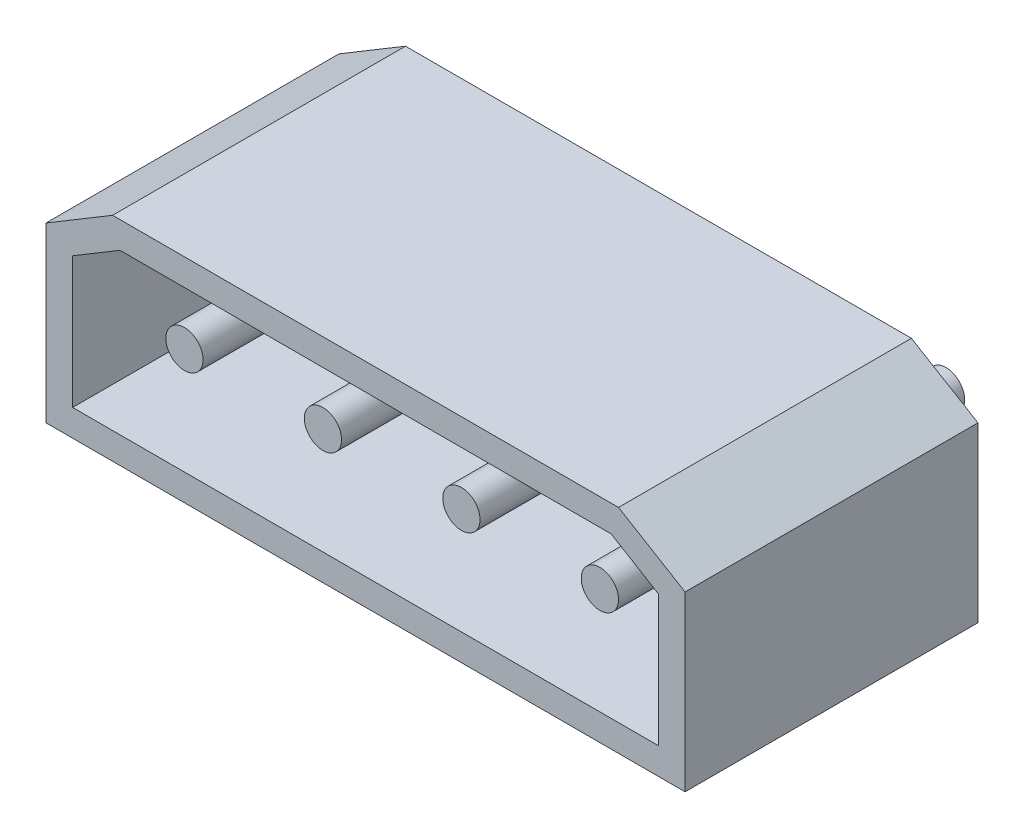
ISO-10303-21;
HEADER;
FILE_DESCRIPTION(('STEP AP214'),'2;1');
FILE_NAME('part.step','',(''),(''),'','','');
FILE_SCHEMA(('AUTOMOTIVE_DESIGN { 1 0 10303 214 1 1 1 1 }'));
ENDSEC;
DATA;
#1=APPLICATION_CONTEXT('core data for automotive mechanical design processes');
#2=APPLICATION_PROTOCOL_DEFINITION('international standard','automotive_design',2000,#1);
#3=PRODUCT_CONTEXT('',#1,'mechanical');
#4=PRODUCT('Part','Part','',(#3));
#5=PRODUCT_RELATED_PRODUCT_CATEGORY('part','',(#4));
#6=PRODUCT_DEFINITION_FORMATION('','',#4);
#7=PRODUCT_DEFINITION_CONTEXT('part definition',#1,'design');
#8=PRODUCT_DEFINITION('design','',#6,#7);
#9=PRODUCT_DEFINITION_SHAPE('','',#8);
#10=(LENGTH_UNIT() NAMED_UNIT(*) SI_UNIT(.MILLI.,.METRE.));
#11=(NAMED_UNIT(*) PLANE_ANGLE_UNIT() SI_UNIT($,.RADIAN.));
#12=(NAMED_UNIT(*) SI_UNIT($,.STERADIAN.) SOLID_ANGLE_UNIT());
#13=UNCERTAINTY_MEASURE_WITH_UNIT(LENGTH_MEASURE(1.E-05),#10,'distance_accuracy_value','');
#14=(GEOMETRIC_REPRESENTATION_CONTEXT(3) GLOBAL_UNCERTAINTY_ASSIGNED_CONTEXT((#13)) GLOBAL_UNIT_ASSIGNED_CONTEXT((#10,
#11,#12)) REPRESENTATION_CONTEXT('',''));
#15=CARTESIAN_POINT('',(0.,0.,0.));
#16=DIRECTION('',(0.,0.,1.));
#17=DIRECTION('',(1.,0.,0.));
#18=AXIS2_PLACEMENT_3D('',#15,#16,#17);
#19=CARTESIAN_POINT('',(2907.57830573472,1607.21256662611,10.));
#20=DIRECTION('',(0.,0.,-1.));
#21=DIRECTION('',(-1.,0.,0.));
#22=AXIS2_PLACEMENT_3D('',#19,#20,#21);
#23=CYLINDRICAL_SURFACE('',#22,0.700000000000115);
#24=CARTESIAN_POINT('',(2907.57830573472,1607.21256662611,2.));
#25=DIRECTION('',(0.,0.,1.));
#26=DIRECTION('',(1.,0.,0.));
#27=AXIS2_PLACEMENT_3D('',#24,#25,#26);
#28=CIRCLE('',#27,0.700000000000115);
#29=CARTESIAN_POINT('',(2908.27830573472,1607.21256662611,2.));
#30=VERTEX_POINT('',#29);
#31=EDGE_CURVE('E42',#30,#30,#28,.F.);
#32=ORIENTED_EDGE('',*,*,#31,.F.);
#33=EDGE_LOOP('',(#32));
#34=FACE_BOUND('',#33,.T.);
#35=CARTESIAN_POINT('',(2907.57830573472,1607.21256662611,10.));
#36=DIRECTION('',(0.,0.,1.));
#37=DIRECTION('',(1.,0.,0.));
#38=AXIS2_PLACEMENT_3D('',#35,#36,#37);
#39=CIRCLE('',#38,0.700000000000115);
#40=CARTESIAN_POINT('',(2908.27830573472,1607.21256662611,10.));
#41=VERTEX_POINT('',#40);
#42=EDGE_CURVE('E11',#41,#41,#39,.T.);
#43=ORIENTED_EDGE('',*,*,#42,.F.);
#44=EDGE_LOOP('',(#43));
#45=FACE_BOUND('',#44,.T.);
#46=ADVANCED_FACE('F35',(#34,#45),#23,.T.);
#47=CARTESIAN_POINT('',(2907.57830573472,1607.21256662611,10.));
#48=DIRECTION('',(0.,0.,1.));
#49=DIRECTION('',(1.,0.,0.));
#50=AXIS2_PLACEMENT_3D('',#47,#48,#49);
#51=PLANE('',#50);
#52=ORIENTED_EDGE('',*,*,#42,.T.);
#53=EDGE_LOOP('',(#52));
#54=FACE_BOUND('',#53,.T.);
#55=ADVANCED_FACE('F189',(#54),#51,.T.);
#56=CARTESIAN_POINT('',(2902.37830573472,1607.21256662611,10.));
#57=DIRECTION('',(0.,0.,-1.));
#58=DIRECTION('',(-1.,0.,0.));
#59=AXIS2_PLACEMENT_3D('',#56,#57,#58);
#60=CYLINDRICAL_SURFACE('',#59,0.700000000000115);
#61=CARTESIAN_POINT('',(2902.37830573472,1607.21256662611,2.));
#62=DIRECTION('',(0.,0.,1.));
#63=DIRECTION('',(1.,0.,0.));
#64=AXIS2_PLACEMENT_3D('',#61,#62,#63);
#65=CIRCLE('',#64,0.700000000000115);
#66=CARTESIAN_POINT('',(2903.07830573472,1607.21256662611,2.));
#67=VERTEX_POINT('',#66);
#68=EDGE_CURVE('E177',#67,#67,#65,.F.);
#69=ORIENTED_EDGE('',*,*,#68,.F.);
#70=EDGE_LOOP('',(#69));
#71=FACE_BOUND('',#70,.T.);
#72=CARTESIAN_POINT('',(2902.37830573472,1607.21256662611,10.));
#73=DIRECTION('',(0.,0.,1.));
#74=DIRECTION('',(1.,0.,0.));
#75=AXIS2_PLACEMENT_3D('',#72,#73,#74);
#76=CIRCLE('',#75,0.700000000000115);
#77=CARTESIAN_POINT('',(2903.07830573472,1607.21256662611,10.));
#78=VERTEX_POINT('',#77);
#79=EDGE_CURVE('E180',#78,#78,#76,.T.);
#80=ORIENTED_EDGE('',*,*,#79,.F.);
#81=EDGE_LOOP('',(#80));
#82=FACE_BOUND('',#81,.T.);
#83=ADVANCED_FACE('F193',(#71,#82),#60,.T.);
#84=CARTESIAN_POINT('',(2902.37830573472,1607.21256662611,10.));
#85=DIRECTION('',(0.,0.,1.));
#86=DIRECTION('',(1.,0.,0.));
#87=AXIS2_PLACEMENT_3D('',#84,#85,#86);
#88=PLANE('',#87);
#89=ORIENTED_EDGE('',*,*,#79,.T.);
#90=EDGE_LOOP('',(#89));
#91=FACE_BOUND('',#90,.T.);
#92=ADVANCED_FACE('F197',(#91),#88,.T.);
#93=CARTESIAN_POINT('',(2907.57830573472,1607.21256662611,-3.));
#94=DIRECTION('',(0.,0.,-1.));
#95=DIRECTION('',(-1.,0.,0.));
#96=AXIS2_PLACEMENT_3D('',#93,#94,#95);
#97=PLANE('',#96);
#98=CARTESIAN_POINT('',(2907.57830573472,1607.21256662611,-3.));
#99=DIRECTION('',(0.,0.,-1.));
#100=DIRECTION('',(-1.,0.,0.));
#101=AXIS2_PLACEMENT_3D('',#98,#99,#100);
#102=CIRCLE('',#101,0.700000000000115);
#103=CARTESIAN_POINT('',(2906.87830573472,1607.21256662611,-3.));
#104=VERTEX_POINT('',#103);
#105=EDGE_CURVE('E174',#104,#104,#102,.T.);
#106=ORIENTED_EDGE('',*,*,#105,.T.);
#107=EDGE_LOOP('',(#106));
#108=FACE_BOUND('',#107,.T.);
#109=ADVANCED_FACE('F203',(#108),#97,.T.);
#110=CARTESIAN_POINT('',(2907.57830573472,1607.21256662611,10.));
#111=DIRECTION('',(0.,0.,-1.));
#112=DIRECTION('',(-1.,0.,0.));
#113=AXIS2_PLACEMENT_3D('',#110,#111,#112);
#114=CYLINDRICAL_SURFACE('',#113,0.700000000000115);
#115=CARTESIAN_POINT('',(2907.57830573472,1607.21256662611,0.));
#116=DIRECTION('',(0.,0.,1.));
#117=DIRECTION('',(1.,0.,0.));
#118=AXIS2_PLACEMENT_3D('',#115,#116,#117);
#119=CIRCLE('',#118,0.700000000000115);
#120=CARTESIAN_POINT('',(2908.27830573472,1607.21256662611,0.));
#121=VERTEX_POINT('',#120);
#122=EDGE_CURVE('E171',#121,#121,#119,.F.);
#123=ORIENTED_EDGE('',*,*,#122,.T.);
#124=EDGE_LOOP('',(#123));
#125=FACE_BOUND('',#124,.T.);
#126=ORIENTED_EDGE('',*,*,#105,.F.);
#127=EDGE_LOOP('',(#126));
#128=FACE_BOUND('',#127,.T.);
#129=ADVANCED_FACE('F207',(#125,#128),#114,.T.);
#130=CARTESIAN_POINT('',(2902.37830573472,1607.21256662611,-3.));
#131=DIRECTION('',(0.,0.,-1.));
#132=DIRECTION('',(-1.,0.,0.));
#133=AXIS2_PLACEMENT_3D('',#130,#131,#132);
#134=PLANE('',#133);
#135=CARTESIAN_POINT('',(2902.37830573472,1607.21256662611,-3.));
#136=DIRECTION('',(0.,0.,-1.));
#137=DIRECTION('',(-1.,0.,0.));
#138=AXIS2_PLACEMENT_3D('',#135,#136,#137);
#139=CIRCLE('',#138,0.700000000000115);
#140=CARTESIAN_POINT('',(2901.67830573472,1607.21256662611,-3.));
#141=VERTEX_POINT('',#140);
#142=EDGE_CURVE('E168',#141,#141,#139,.T.);
#143=ORIENTED_EDGE('',*,*,#142,.T.);
#144=EDGE_LOOP('',(#143));
#145=FACE_BOUND('',#144,.T.);
#146=ADVANCED_FACE('F211',(#145),#134,.T.);
#147=CARTESIAN_POINT('',(2902.37830573472,1607.21256662611,10.));
#148=DIRECTION('',(0.,0.,-1.));
#149=DIRECTION('',(-1.,0.,0.));
#150=AXIS2_PLACEMENT_3D('',#147,#148,#149);
#151=CYLINDRICAL_SURFACE('',#150,0.700000000000115);
#152=CARTESIAN_POINT('',(2902.37830573472,1607.21256662611,0.));
#153=DIRECTION('',(0.,0.,1.));
#154=DIRECTION('',(1.,0.,0.));
#155=AXIS2_PLACEMENT_3D('',#152,#153,#154);
#156=CIRCLE('',#155,0.700000000000115);
#157=CARTESIAN_POINT('',(2903.07830573472,1607.21256662611,0.));
#158=VERTEX_POINT('',#157);
#159=EDGE_CURVE('E165',#158,#158,#156,.F.);
#160=ORIENTED_EDGE('',*,*,#159,.T.);
#161=EDGE_LOOP('',(#160));
#162=FACE_BOUND('',#161,.T.);
#163=ORIENTED_EDGE('',*,*,#142,.F.);
#164=EDGE_LOOP('',(#163));
#165=FACE_BOUND('',#164,.T.);
#166=ADVANCED_FACE('F215',(#162,#165),#151,.T.);
#167=CARTESIAN_POINT('',(2891.97830573472,1607.21256662611,10.));
#168=DIRECTION('',(0.,0.,-1.));
#169=DIRECTION('',(-1.,0.,0.));
#170=AXIS2_PLACEMENT_3D('',#167,#168,#169);
#171=CYLINDRICAL_SURFACE('',#170,0.700000000000115);
#172=CARTESIAN_POINT('',(2891.97830573472,1607.21256662611,0.));
#173=DIRECTION('',(0.,0.,1.));
#174=DIRECTION('',(1.,0.,0.));
#175=AXIS2_PLACEMENT_3D('',#172,#173,#174);
#176=CIRCLE('',#175,0.700000000000115);
#177=CARTESIAN_POINT('',(2892.67830573472,1607.21256662611,0.));
#178=VERTEX_POINT('',#177);
#179=EDGE_CURVE('E153',#178,#178,#176,.F.);
#180=ORIENTED_EDGE('',*,*,#179,.T.);
#181=EDGE_LOOP('',(#180));
#182=FACE_BOUND('',#181,.T.);
#183=CARTESIAN_POINT('',(2891.97830573472,1607.21256662611,-3.));
#184=DIRECTION('',(0.,0.,-1.));
#185=DIRECTION('',(-1.,0.,0.));
#186=AXIS2_PLACEMENT_3D('',#183,#184,#185);
#187=CIRCLE('',#186,0.700000000000115);
#188=CARTESIAN_POINT('',(2891.27830573472,1607.21256662611,-3.));
#189=VERTEX_POINT('',#188);
#190=EDGE_CURVE('E158',#189,#189,#187,.T.);
#191=ORIENTED_EDGE('',*,*,#190,.F.);
#192=EDGE_LOOP('',(#191));
#193=FACE_BOUND('',#192,.T.);
#194=ADVANCED_FACE('F219',(#182,#193),#171,.T.);
#195=CARTESIAN_POINT('',(2887.77830573472,1609.71256662611,11.));
#196=DIRECTION('',(0.514495755427549,-0.857492925712531,0.));
#197=DIRECTION('',(0.857492925712531,0.514495755427549,0.));
#198=AXIS2_PLACEMENT_3D('',#195,#196,#197);
#199=PLANE('',#198);
#200=DIRECTION('',(-0.857492925712531,-0.514495755427549,0.));
#201=VECTOR('',#200,1.);
#202=CARTESIAN_POINT('',(2887.77830573472,1609.71256662611,0.));
#203=LINE('',#202,#201);
#204=CARTESIAN_POINT('',(2890.27830573472,1611.21256662611,0.));
#205=VERTEX_POINT('',#204);
#206=CARTESIAN_POINT('',(2887.77830573472,1609.71256662611,0.));
#207=VERTEX_POINT('',#206);
#208=EDGE_CURVE('E132',#205,#207,#203,.T.);
#209=ORIENTED_EDGE('',*,*,#208,.T.);
#210=DIRECTION('',(0.,0.,-1.));
#211=VECTOR('',#210,1.);
#212=CARTESIAN_POINT('',(2887.77830573472,1609.71256662611,11.));
#213=LINE('',#212,#211);
#214=CARTESIAN_POINT('',(2887.77830573472,1609.71256662611,11.));
#215=VERTEX_POINT('',#214);
#216=EDGE_CURVE('E151',#215,#207,#213,.T.);
#217=ORIENTED_EDGE('',*,*,#216,.F.);
#218=DIRECTION('',(-0.857492925712531,-0.514495755427549,0.));
#219=VECTOR('',#218,1.);
#220=CARTESIAN_POINT('',(2887.77830573472,1609.71256662611,11.));
#221=LINE('',#220,#219);
#222=CARTESIAN_POINT('',(2890.27830573472,1611.21256662611,11.));
#223=VERTEX_POINT('',#222);
#224=EDGE_CURVE('E144',#223,#215,#221,.T.);
#225=ORIENTED_EDGE('',*,*,#224,.F.);
#226=DIRECTION('',(0.,0.,-1.));
#227=VECTOR('',#226,1.);
#228=CARTESIAN_POINT('',(2890.27830573472,1611.21256662611,11.));
#229=LINE('',#228,#227);
#230=EDGE_CURVE('E128',#223,#205,#229,.T.);
#231=ORIENTED_EDGE('',*,*,#230,.T.);
#232=EDGE_LOOP('',(#209,#217,#225,#231));
#233=FACE_BOUND('',#232,.T.);
#234=ADVANCED_FACE('F221',(#233),#199,.F.);
#235=CARTESIAN_POINT('',(2887.77830573472,1603.21256662611,11.));
#236=DIRECTION('',(1.,0.,0.));
#237=DIRECTION('',(0.,0.,-1.));
#238=AXIS2_PLACEMENT_3D('',#235,#236,#237);
#239=PLANE('',#238);
#240=DIRECTION('',(0.,-1.,0.));
#241=VECTOR('',#240,1.);
#242=CARTESIAN_POINT('',(2887.77830573472,1603.21256662611,0.));
#243=LINE('',#242,#241);
#244=CARTESIAN_POINT('',(2887.77830573472,1603.21256662611,0.));
#245=VERTEX_POINT('',#244);
#246=EDGE_CURVE('E135',#207,#245,#243,.T.);
#247=ORIENTED_EDGE('',*,*,#246,.T.);
#248=DIRECTION('',(0.,0.,-1.));
#249=VECTOR('',#248,1.);
#250=CARTESIAN_POINT('',(2887.77830573472,1603.21256662611,11.));
#251=LINE('',#250,#249);
#252=CARTESIAN_POINT('',(2887.77830573472,1603.21256662611,11.));
#253=VERTEX_POINT('',#252);
#254=EDGE_CURVE('E148',#253,#245,#251,.T.);
#255=ORIENTED_EDGE('',*,*,#254,.F.);
#256=DIRECTION('',(0.,-1.,0.));
#257=VECTOR('',#256,1.);
#258=CARTESIAN_POINT('',(2887.77830573472,1603.21256662611,11.));
#259=LINE('',#258,#257);
#260=EDGE_CURVE('E94',#215,#253,#259,.T.);
#261=ORIENTED_EDGE('',*,*,#260,.F.);
#262=ORIENTED_EDGE('',*,*,#216,.T.);
#263=EDGE_LOOP('',(#247,#255,#261,#262));
#264=FACE_BOUND('',#263,.T.);
#265=ADVANCED_FACE('F224',(#264),#239,.F.);
#266=CARTESIAN_POINT('',(2887.77830573472,1603.21256662611,11.));
#267=DIRECTION('',(0.,1.,0.));
#268=DIRECTION('',(0.,0.,1.));
#269=AXIS2_PLACEMENT_3D('',#266,#267,#268);
#270=PLANE('',#269);
#271=DIRECTION('',(1.,0.,0.));
#272=VECTOR('',#271,1.);
#273=CARTESIAN_POINT('',(2887.77830573472,1603.21256662611,0.));
#274=LINE('',#273,#272);
#275=CARTESIAN_POINT('',(2911.77830573472,1603.21256662611,0.));
#276=VERTEX_POINT('',#275);
#277=EDGE_CURVE('E138',#245,#276,#274,.T.);
#278=ORIENTED_EDGE('',*,*,#277,.T.);
#279=DIRECTION('',(0.,0.,-1.));
#280=VECTOR('',#279,1.);
#281=CARTESIAN_POINT('',(2911.77830573472,1603.21256662611,11.));
#282=LINE('',#281,#280);
#283=CARTESIAN_POINT('',(2911.77830573472,1603.21256662611,11.));
#284=VERTEX_POINT('',#283);
#285=EDGE_CURVE('E123',#284,#276,#282,.T.);
#286=ORIENTED_EDGE('',*,*,#285,.F.);
#287=DIRECTION('',(1.,0.,0.));
#288=VECTOR('',#287,1.);
#289=CARTESIAN_POINT('',(2887.77830573472,1603.21256662611,11.));
#290=LINE('',#289,#288);
#291=EDGE_CURVE('E111',#253,#284,#290,.T.);
#292=ORIENTED_EDGE('',*,*,#291,.F.);
#293=ORIENTED_EDGE('',*,*,#254,.T.);
#294=EDGE_LOOP('',(#278,#286,#292,#293));
#295=FACE_BOUND('',#294,.T.);
#296=ADVANCED_FACE('F228',(#295),#270,.F.);
#297=CARTESIAN_POINT('',(2911.77830573472,1603.21256662611,11.));
#298=DIRECTION('',(-1.,0.,0.));
#299=DIRECTION('',(0.,0.,1.));
#300=AXIS2_PLACEMENT_3D('',#297,#298,#299);
#301=PLANE('',#300);
#302=DIRECTION('',(0.,1.,0.));
#303=VECTOR('',#302,1.);
#304=CARTESIAN_POINT('',(2911.77830573472,1603.21256662611,0.));
#305=LINE('',#304,#303);
#306=CARTESIAN_POINT('',(2911.77830573472,1609.71256662611,0.));
#307=VERTEX_POINT('',#306);
#308=EDGE_CURVE('E120',#276,#307,#305,.T.);
#309=ORIENTED_EDGE('',*,*,#308,.T.);
#310=DIRECTION('',(0.,0.,-1.));
#311=VECTOR('',#310,1.);
#312=CARTESIAN_POINT('',(2911.77830573472,1609.71256662611,11.));
#313=LINE('',#312,#311);
#314=CARTESIAN_POINT('',(2911.77830573472,1609.71256662611,11.));
#315=VERTEX_POINT('',#314);
#316=EDGE_CURVE('E117',#315,#307,#313,.T.);
#317=ORIENTED_EDGE('',*,*,#316,.F.);
#318=DIRECTION('',(0.,1.,0.));
#319=VECTOR('',#318,1.);
#320=CARTESIAN_POINT('',(2911.77830573472,1603.21256662611,11.));
#321=LINE('',#320,#319);
#322=EDGE_CURVE('E104',#284,#315,#321,.T.);
#323=ORIENTED_EDGE('',*,*,#322,.F.);
#324=ORIENTED_EDGE('',*,*,#285,.T.);
#325=EDGE_LOOP('',(#309,#317,#323,#324));
#326=FACE_BOUND('',#325,.T.);
#327=ADVANCED_FACE('F118',(#326),#301,.F.);
#328=CARTESIAN_POINT('',(2911.77830573472,1609.71256662611,11.));
#329=DIRECTION('',(-0.514495755427549,-0.857492925712531,0.));
#330=DIRECTION('',(0.857492925712531,-0.514495755427549,0.));
#331=AXIS2_PLACEMENT_3D('',#328,#329,#330);
#332=PLANE('',#331);
#333=DIRECTION('',(-0.857492925712531,0.514495755427549,0.));
#334=VECTOR('',#333,1.);
#335=CARTESIAN_POINT('',(2911.77830573472,1609.71256662611,0.));
#336=LINE('',#335,#334);
#337=CARTESIAN_POINT('',(2909.27830573472,1611.21256662611,0.));
#338=VERTEX_POINT('',#337);
#339=EDGE_CURVE('E141',#307,#338,#336,.T.);
#340=ORIENTED_EDGE('',*,*,#339,.T.);
#341=DIRECTION('',(0.,0.,-1.));
#342=VECTOR('',#341,1.);
#343=CARTESIAN_POINT('',(2909.27830573472,1611.21256662611,11.));
#344=LINE('',#343,#342);
#345=CARTESIAN_POINT('',(2909.27830573472,1611.21256662611,11.));
#346=VERTEX_POINT('',#345);
#347=EDGE_CURVE('E124',#346,#338,#344,.T.);
#348=ORIENTED_EDGE('',*,*,#347,.F.);
#349=DIRECTION('',(-0.857492925712531,0.514495755427549,0.));
#350=VECTOR('',#349,1.);
#351=CARTESIAN_POINT('',(2911.77830573472,1609.71256662611,11.));
#352=LINE('',#351,#350);
#353=EDGE_CURVE('E108',#315,#346,#352,.T.);
#354=ORIENTED_EDGE('',*,*,#353,.F.);
#355=ORIENTED_EDGE('',*,*,#316,.T.);
#356=EDGE_LOOP('',(#340,#348,#354,#355));
#357=FACE_BOUND('',#356,.T.);
#358=ADVANCED_FACE('F126',(#357),#332,.F.);
#359=CARTESIAN_POINT('',(2890.27830573472,1611.21256662611,11.));
#360=DIRECTION('',(0.,-1.,0.));
#361=DIRECTION('',(0.,0.,-1.));
#362=AXIS2_PLACEMENT_3D('',#359,#360,#361);
#363=PLANE('',#362);
#364=DIRECTION('',(-1.,0.,0.));
#365=VECTOR('',#364,1.);
#366=CARTESIAN_POINT('',(2890.27830573472,1611.21256662611,0.));
#367=LINE('',#366,#365);
#368=EDGE_CURVE('E85',#338,#205,#367,.T.);
#369=ORIENTED_EDGE('',*,*,#368,.T.);
#370=ORIENTED_EDGE('',*,*,#230,.F.);
#371=DIRECTION('',(-1.,0.,0.));
#372=VECTOR('',#371,1.);
#373=CARTESIAN_POINT('',(2890.27830573472,1611.21256662611,11.));
#374=LINE('',#373,#372);
#375=EDGE_CURVE('E58',#346,#223,#374,.T.);
#376=ORIENTED_EDGE('',*,*,#375,.F.);
#377=ORIENTED_EDGE('',*,*,#347,.T.);
#378=EDGE_LOOP('',(#369,#370,#376,#377));
#379=FACE_BOUND('',#378,.T.);
#380=ADVANCED_FACE('F236',(#379),#363,.F.);
#381=CARTESIAN_POINT('',(0.,0.,11.));
#382=DIRECTION('',(0.,0.,1.));
#383=DIRECTION('',(1.,0.,0.));
#384=AXIS2_PLACEMENT_3D('',#381,#382,#383);
#385=PLANE('',#384);
#386=DIRECTION('',(-1.,0.,0.));
#387=VECTOR('',#386,1.);
#388=CARTESIAN_POINT('',(2909.00132176977,1610.21256662611,11.));
#389=LINE('',#388,#387);
#390=CARTESIAN_POINT('',(2909.00132176977,1610.21256662611,11.));
#391=VERTEX_POINT('',#390);
#392=CARTESIAN_POINT('',(2890.55528969967,1610.21256662611,11.));
#393=VERTEX_POINT('',#392);
#394=EDGE_CURVE('E49',#391,#393,#389,.T.);
#395=ORIENTED_EDGE('',*,*,#394,.F.);
#396=DIRECTION('',(-0.857492925712535,0.514495755427542,0.));
#397=VECTOR('',#396,1.);
#398=CARTESIAN_POINT('',(2910.77830573472,1609.14637624714,11.));
#399=LINE('',#398,#397);
#400=CARTESIAN_POINT('',(2910.77830573472,1609.14637624714,11.));
#401=VERTEX_POINT('',#400);
#402=EDGE_CURVE('E321',#401,#391,#399,.T.);
#403=ORIENTED_EDGE('',*,*,#402,.F.);
#404=DIRECTION('',(0.,1.,0.));
#405=VECTOR('',#404,1.);
#406=CARTESIAN_POINT('',(2910.77830573472,1604.21256662611,11.));
#407=LINE('',#406,#405);
#408=CARTESIAN_POINT('',(2910.77830573472,1604.21256662611,11.));
#409=VERTEX_POINT('',#408);
#410=EDGE_CURVE('E347',#409,#401,#407,.T.);
#411=ORIENTED_EDGE('',*,*,#410,.F.);
#412=DIRECTION('',(1.,0.,0.));
#413=VECTOR('',#412,1.);
#414=CARTESIAN_POINT('',(2888.77830573472,1604.21256662611,11.));
#415=LINE('',#414,#413);
#416=CARTESIAN_POINT('',(2888.77830573472,1604.21256662611,11.));
#417=VERTEX_POINT('',#416);
#418=EDGE_CURVE('E344',#417,#409,#415,.T.);
#419=ORIENTED_EDGE('',*,*,#418,.F.);
#420=DIRECTION('',(0.,-1.,0.));
#421=VECTOR('',#420,1.);
#422=CARTESIAN_POINT('',(2888.77830573472,1609.14637624714,11.));
#423=LINE('',#422,#421);
#424=CARTESIAN_POINT('',(2888.77830573472,1609.14637624714,11.));
#425=VERTEX_POINT('',#424);
#426=EDGE_CURVE('E341',#425,#417,#423,.T.);
#427=ORIENTED_EDGE('',*,*,#426,.F.);
#428=DIRECTION('',(-0.857492925712535,-0.514495755427542,0.));
#429=VECTOR('',#428,1.);
#430=CARTESIAN_POINT('',(2890.55528969967,1610.21256662611,11.));
#431=LINE('',#430,#429);
#432=EDGE_CURVE('E338',#393,#425,#431,.T.);
#433=ORIENTED_EDGE('',*,*,#432,.F.);
#434=EDGE_LOOP('',(#395,#403,#411,#419,#427,#433));
#435=FACE_BOUND('',#434,.T.);
#436=ORIENTED_EDGE('',*,*,#224,.T.);
#437=ORIENTED_EDGE('',*,*,#260,.T.);
#438=ORIENTED_EDGE('',*,*,#291,.T.);
#439=ORIENTED_EDGE('',*,*,#322,.T.);
#440=ORIENTED_EDGE('',*,*,#353,.T.);
#441=ORIENTED_EDGE('',*,*,#375,.T.);
#442=EDGE_LOOP('',(#436,#437,#438,#439,#440,#441));
#443=FACE_BOUND('',#442,.T.);
#444=ADVANCED_FACE('F106',(#435,#443),#385,.T.);
#445=CARTESIAN_POINT('',(0.,0.,0.));
#446=DIRECTION('',(0.,0.,1.));
#447=DIRECTION('',(1.,0.,0.));
#448=AXIS2_PLACEMENT_3D('',#445,#446,#447);
#449=PLANE('',#448);
#450=CARTESIAN_POINT('',(2897.17830573472,1607.21256662611,0.));
#451=DIRECTION('',(0.,0.,1.));
#452=DIRECTION('',(1.,0.,0.));
#453=AXIS2_PLACEMENT_3D('',#450,#451,#452);
#454=CIRCLE('',#453,0.700000000000115);
#455=CARTESIAN_POINT('',(2897.87830573472,1607.21256662611,0.));
#456=VERTEX_POINT('',#455);
#457=EDGE_CURVE('E162',#456,#456,#454,.F.);
#458=ORIENTED_EDGE('',*,*,#457,.F.);
#459=EDGE_LOOP('',(#458));
#460=FACE_BOUND('',#459,.T.);
#461=ORIENTED_EDGE('',*,*,#179,.F.);
#462=EDGE_LOOP('',(#461));
#463=FACE_BOUND('',#462,.T.);
#464=ORIENTED_EDGE('',*,*,#208,.F.);
#465=ORIENTED_EDGE('',*,*,#368,.F.);
#466=ORIENTED_EDGE('',*,*,#339,.F.);
#467=ORIENTED_EDGE('',*,*,#308,.F.);
#468=ORIENTED_EDGE('',*,*,#277,.F.);
#469=ORIENTED_EDGE('',*,*,#246,.F.);
#470=EDGE_LOOP('',(#464,#465,#466,#467,#468,#469));
#471=FACE_BOUND('',#470,.T.);
#472=ORIENTED_EDGE('',*,*,#159,.F.);
#473=EDGE_LOOP('',(#472));
#474=FACE_BOUND('',#473,.T.);
#475=ORIENTED_EDGE('',*,*,#122,.F.);
#476=EDGE_LOOP('',(#475));
#477=FACE_BOUND('',#476,.T.);
#478=ADVANCED_FACE('F239',(#460,#463,#471,#474,#477),#449,.F.);
#479=CARTESIAN_POINT('',(2909.00132176977,1610.21256662611,2.));
#480=DIRECTION('',(0.,1.,0.));
#481=DIRECTION('',(0.,0.,1.));
#482=AXIS2_PLACEMENT_3D('',#479,#480,#481);
#483=PLANE('',#482);
#484=ORIENTED_EDGE('',*,*,#394,.T.);
#485=DIRECTION('',(0.,0.,1.));
#486=VECTOR('',#485,1.);
#487=CARTESIAN_POINT('',(2890.55528969967,1610.21256662611,2.));
#488=LINE('',#487,#486);
#489=CARTESIAN_POINT('',(2890.55528969967,1610.21256662611,2.));
#490=VERTEX_POINT('',#489);
#491=EDGE_CURVE('E336',#490,#393,#488,.T.);
#492=ORIENTED_EDGE('',*,*,#491,.F.);
#493=DIRECTION('',(-1.,0.,0.));
#494=VECTOR('',#493,1.);
#495=CARTESIAN_POINT('',(2909.00132176977,1610.21256662611,2.));
#496=LINE('',#495,#494);
#497=CARTESIAN_POINT('',(2909.00132176977,1610.21256662611,2.));
#498=VERTEX_POINT('',#497);
#499=EDGE_CURVE('E317',#498,#490,#496,.T.);
#500=ORIENTED_EDGE('',*,*,#499,.F.);
#501=DIRECTION('',(0.,0.,1.));
#502=VECTOR('',#501,1.);
#503=CARTESIAN_POINT('',(2909.00132176977,1610.21256662611,2.));
#504=LINE('',#503,#502);
#505=EDGE_CURVE('E136',#498,#391,#504,.T.);
#506=ORIENTED_EDGE('',*,*,#505,.T.);
#507=EDGE_LOOP('',(#484,#492,#500,#506));
#508=FACE_BOUND('',#507,.T.);
#509=ADVANCED_FACE('F242',(#508),#483,.F.);
#510=CARTESIAN_POINT('',(2910.77830573472,1609.14637624714,2.));
#511=DIRECTION('',(0.514495755427542,0.857492925712535,0.));
#512=DIRECTION('',(-0.857492925712535,0.514495755427542,0.));
#513=AXIS2_PLACEMENT_3D('',#510,#511,#512);
#514=PLANE('',#513);
#515=ORIENTED_EDGE('',*,*,#402,.T.);
#516=ORIENTED_EDGE('',*,*,#505,.F.);
#517=DIRECTION('',(-0.857492925712535,0.514495755427542,0.));
#518=VECTOR('',#517,1.);
#519=CARTESIAN_POINT('',(2910.77830573472,1609.14637624714,2.));
#520=LINE('',#519,#518);
#521=CARTESIAN_POINT('',(2910.77830573472,1609.14637624714,2.));
#522=VERTEX_POINT('',#521);
#523=EDGE_CURVE('E333',#522,#498,#520,.T.);
#524=ORIENTED_EDGE('',*,*,#523,.F.);
#525=DIRECTION('',(0.,0.,1.));
#526=VECTOR('',#525,1.);
#527=CARTESIAN_POINT('',(2910.77830573472,1609.14637624714,2.));
#528=LINE('',#527,#526);
#529=EDGE_CURVE('E353',#522,#401,#528,.T.);
#530=ORIENTED_EDGE('',*,*,#529,.T.);
#531=EDGE_LOOP('',(#515,#516,#524,#530));
#532=FACE_BOUND('',#531,.T.);
#533=ADVANCED_FACE('F249',(#532),#514,.F.);
#534=CARTESIAN_POINT('',(2910.77830573472,1604.21256662611,2.));
#535=DIRECTION('',(1.,0.,0.));
#536=DIRECTION('',(0.,0.,-1.));
#537=AXIS2_PLACEMENT_3D('',#534,#535,#536);
#538=PLANE('',#537);
#539=ORIENTED_EDGE('',*,*,#410,.T.);
#540=ORIENTED_EDGE('',*,*,#529,.F.);
#541=DIRECTION('',(0.,1.,0.));
#542=VECTOR('',#541,1.);
#543=CARTESIAN_POINT('',(2910.77830573472,1604.21256662611,2.));
#544=LINE('',#543,#542);
#545=CARTESIAN_POINT('',(2910.77830573472,1604.21256662611,2.));
#546=VERTEX_POINT('',#545);
#547=EDGE_CURVE('E330',#546,#522,#544,.T.);
#548=ORIENTED_EDGE('',*,*,#547,.F.);
#549=DIRECTION('',(0.,0.,1.));
#550=VECTOR('',#549,1.);
#551=CARTESIAN_POINT('',(2910.77830573472,1604.21256662611,2.));
#552=LINE('',#551,#550);
#553=EDGE_CURVE('E356',#546,#409,#552,.T.);
#554=ORIENTED_EDGE('',*,*,#553,.T.);
#555=EDGE_LOOP('',(#539,#540,#548,#554));
#556=FACE_BOUND('',#555,.T.);
#557=ADVANCED_FACE('F261',(#556),#538,.F.);
#558=CARTESIAN_POINT('',(2888.77830573472,1604.21256662611,2.));
#559=DIRECTION('',(0.,-1.,0.));
#560=DIRECTION('',(0.,0.,-1.));
#561=AXIS2_PLACEMENT_3D('',#558,#559,#560);
#562=PLANE('',#561);
#563=ORIENTED_EDGE('',*,*,#418,.T.);
#564=ORIENTED_EDGE('',*,*,#553,.F.);
#565=DIRECTION('',(1.,0.,0.));
#566=VECTOR('',#565,1.);
#567=CARTESIAN_POINT('',(2888.77830573472,1604.21256662611,2.));
#568=LINE('',#567,#566);
#569=CARTESIAN_POINT('',(2888.77830573472,1604.21256662611,2.));
#570=VERTEX_POINT('',#569);
#571=EDGE_CURVE('E327',#570,#546,#568,.T.);
#572=ORIENTED_EDGE('',*,*,#571,.F.);
#573=DIRECTION('',(0.,0.,1.));
#574=VECTOR('',#573,1.);
#575=CARTESIAN_POINT('',(2888.77830573472,1604.21256662611,2.));
#576=LINE('',#575,#574);
#577=EDGE_CURVE('E359',#570,#417,#576,.T.);
#578=ORIENTED_EDGE('',*,*,#577,.T.);
#579=EDGE_LOOP('',(#563,#564,#572,#578));
#580=FACE_BOUND('',#579,.T.);
#581=ADVANCED_FACE('F257',(#580),#562,.F.);
#582=CARTESIAN_POINT('',(2888.77830573472,1609.14637624714,2.));
#583=DIRECTION('',(-1.,0.,0.));
#584=DIRECTION('',(0.,0.,1.));
#585=AXIS2_PLACEMENT_3D('',#582,#583,#584);
#586=PLANE('',#585);
#587=ORIENTED_EDGE('',*,*,#426,.T.);
#588=ORIENTED_EDGE('',*,*,#577,.F.);
#589=DIRECTION('',(0.,-1.,0.));
#590=VECTOR('',#589,1.);
#591=CARTESIAN_POINT('',(2888.77830573472,1609.14637624714,2.));
#592=LINE('',#591,#590);
#593=CARTESIAN_POINT('',(2888.77830573472,1609.14637624714,2.));
#594=VERTEX_POINT('',#593);
#595=EDGE_CURVE('E324',#594,#570,#592,.T.);
#596=ORIENTED_EDGE('',*,*,#595,.F.);
#597=DIRECTION('',(0.,0.,1.));
#598=VECTOR('',#597,1.);
#599=CARTESIAN_POINT('',(2888.77830573472,1609.14637624714,2.));
#600=LINE('',#599,#598);
#601=EDGE_CURVE('E362',#594,#425,#600,.T.);
#602=ORIENTED_EDGE('',*,*,#601,.T.);
#603=EDGE_LOOP('',(#587,#588,#596,#602));
#604=FACE_BOUND('',#603,.T.);
#605=ADVANCED_FACE('F253',(#604),#586,.F.);
#606=CARTESIAN_POINT('',(2890.55528969967,1610.21256662611,2.));
#607=DIRECTION('',(-0.514495755427542,0.857492925712535,0.));
#608=DIRECTION('',(-0.857492925712535,-0.514495755427542,0.));
#609=AXIS2_PLACEMENT_3D('',#606,#607,#608);
#610=PLANE('',#609);
#611=ORIENTED_EDGE('',*,*,#432,.T.);
#612=ORIENTED_EDGE('',*,*,#601,.F.);
#613=DIRECTION('',(-0.857492925712535,-0.514495755427542,0.));
#614=VECTOR('',#613,1.);
#615=CARTESIAN_POINT('',(2890.55528969967,1610.21256662611,2.));
#616=LINE('',#615,#614);
#617=EDGE_CURVE('E320',#490,#594,#616,.T.);
#618=ORIENTED_EDGE('',*,*,#617,.F.);
#619=ORIENTED_EDGE('',*,*,#491,.T.);
#620=EDGE_LOOP('',(#611,#612,#618,#619));
#621=FACE_BOUND('',#620,.T.);
#622=ADVANCED_FACE('F250',(#621),#610,.F.);
#623=CARTESIAN_POINT('',(0.,0.,2.));
#624=DIRECTION('',(0.,0.,1.));
#625=DIRECTION('',(1.,0.,0.));
#626=AXIS2_PLACEMENT_3D('',#623,#624,#625);
#627=PLANE('',#626);
#628=CARTESIAN_POINT('',(2897.17830573472,1607.21256662611,2.));
#629=DIRECTION('',(0.,0.,1.));
#630=DIRECTION('',(1.,0.,0.));
#631=AXIS2_PLACEMENT_3D('',#628,#629,#630);
#632=CIRCLE('',#631,0.700000000000115);
#633=CARTESIAN_POINT('',(2897.87830573472,1607.21256662611,2.));
#634=VERTEX_POINT('',#633);
#635=EDGE_CURVE('E304',#634,#634,#632,.F.);
#636=ORIENTED_EDGE('',*,*,#635,.T.);
#637=EDGE_LOOP('',(#636));
#638=FACE_BOUND('',#637,.T.);
#639=CARTESIAN_POINT('',(2891.97830573472,1607.21256662611,2.));
#640=DIRECTION('',(0.,0.,1.));
#641=DIRECTION('',(1.,0.,0.));
#642=AXIS2_PLACEMENT_3D('',#639,#640,#641);
#643=CIRCLE('',#642,0.700000000000115);
#644=CARTESIAN_POINT('',(2892.67830573472,1607.21256662611,2.));
#645=VERTEX_POINT('',#644);
#646=EDGE_CURVE('E154',#645,#645,#643,.F.);
#647=ORIENTED_EDGE('',*,*,#646,.T.);
#648=EDGE_LOOP('',(#647));
#649=FACE_BOUND('',#648,.T.);
#650=ORIENTED_EDGE('',*,*,#499,.T.);
#651=ORIENTED_EDGE('',*,*,#617,.T.);
#652=ORIENTED_EDGE('',*,*,#595,.T.);
#653=ORIENTED_EDGE('',*,*,#571,.T.);
#654=ORIENTED_EDGE('',*,*,#547,.T.);
#655=ORIENTED_EDGE('',*,*,#523,.T.);
#656=EDGE_LOOP('',(#650,#651,#652,#653,#654,#655));
#657=FACE_BOUND('',#656,.T.);
#658=ORIENTED_EDGE('',*,*,#68,.T.);
#659=EDGE_LOOP('',(#658));
#660=FACE_BOUND('',#659,.T.);
#661=ORIENTED_EDGE('',*,*,#31,.T.);
#662=EDGE_LOOP('',(#661));
#663=FACE_BOUND('',#662,.T.);
#664=ADVANCED_FACE('F185',(#638,#649,#657,#660,#663),#627,.T.);
#665=CARTESIAN_POINT('',(2891.97830573472,1607.21256662611,10.));
#666=DIRECTION('',(0.,0.,1.));
#667=DIRECTION('',(1.,0.,0.));
#668=AXIS2_PLACEMENT_3D('',#665,#666,#667);
#669=PLANE('',#668);
#670=CARTESIAN_POINT('',(2891.97830573472,1607.21256662611,10.));
#671=DIRECTION('',(0.,0.,1.));
#672=DIRECTION('',(1.,0.,0.));
#673=AXIS2_PLACEMENT_3D('',#670,#671,#672);
#674=CIRCLE('',#673,0.700000000000115);
#675=CARTESIAN_POINT('',(2892.67830573472,1607.21256662611,10.));
#676=VERTEX_POINT('',#675);
#677=EDGE_CURVE('E157',#676,#676,#674,.T.);
#678=ORIENTED_EDGE('',*,*,#677,.T.);
#679=EDGE_LOOP('',(#678));
#680=FACE_BOUND('',#679,.T.);
#681=ADVANCED_FACE('F271',(#680),#669,.T.);
#682=ORIENTED_EDGE('',*,*,#646,.F.);
#683=EDGE_LOOP('',(#682));
#684=FACE_BOUND('',#683,.T.);
#685=ORIENTED_EDGE('',*,*,#677,.F.);
#686=EDGE_LOOP('',(#685));
#687=FACE_BOUND('',#686,.T.);
#688=ADVANCED_FACE('F273',(#684,#687),#171,.T.);
#689=CARTESIAN_POINT('',(2891.97830573472,1607.21256662611,-3.));
#690=DIRECTION('',(0.,0.,-1.));
#691=DIRECTION('',(-1.,0.,0.));
#692=AXIS2_PLACEMENT_3D('',#689,#690,#691);
#693=PLANE('',#692);
#694=ORIENTED_EDGE('',*,*,#190,.T.);
#695=EDGE_LOOP('',(#694));
#696=FACE_BOUND('',#695,.T.);
#697=ADVANCED_FACE('F276',(#696),#693,.T.);
#698=CARTESIAN_POINT('',(2897.17830573472,1607.21256662611,10.));
#699=DIRECTION('',(0.,0.,-1.));
#700=DIRECTION('',(-1.,0.,0.));
#701=AXIS2_PLACEMENT_3D('',#698,#699,#700);
#702=CYLINDRICAL_SURFACE('',#701,0.700000000000115);
#703=ORIENTED_EDGE('',*,*,#457,.T.);
#704=EDGE_LOOP('',(#703));
#705=FACE_BOUND('',#704,.T.);
#706=CARTESIAN_POINT('',(2897.17830573472,1607.21256662611,-3.));
#707=DIRECTION('',(0.,0.,-1.));
#708=DIRECTION('',(-1.,0.,0.));
#709=AXIS2_PLACEMENT_3D('',#706,#707,#708);
#710=CIRCLE('',#709,0.700000000000115);
#711=CARTESIAN_POINT('',(2896.47830573472,1607.21256662611,-3.));
#712=VERTEX_POINT('',#711);
#713=EDGE_CURVE('E161',#712,#712,#710,.T.);
#714=ORIENTED_EDGE('',*,*,#713,.F.);
#715=EDGE_LOOP('',(#714));
#716=FACE_BOUND('',#715,.T.);
#717=ADVANCED_FACE('F283',(#705,#716),#702,.T.);
#718=CARTESIAN_POINT('',(2897.17830573472,1607.21256662611,-3.));
#719=DIRECTION('',(0.,0.,-1.));
#720=DIRECTION('',(-1.,0.,0.));
#721=AXIS2_PLACEMENT_3D('',#718,#719,#720);
#722=PLANE('',#721);
#723=ORIENTED_EDGE('',*,*,#713,.T.);
#724=EDGE_LOOP('',(#723));
#725=FACE_BOUND('',#724,.T.);
#726=ADVANCED_FACE('F287',(#725),#722,.T.);
#727=CARTESIAN_POINT('',(2897.17830573472,1607.21256662611,10.));
#728=DIRECTION('',(0.,0.,1.));
#729=DIRECTION('',(1.,0.,0.));
#730=AXIS2_PLACEMENT_3D('',#727,#728,#729);
#731=PLANE('',#730);
#732=CARTESIAN_POINT('',(2897.17830573472,1607.21256662611,10.));
#733=DIRECTION('',(0.,0.,1.));
#734=DIRECTION('',(1.,0.,0.));
#735=AXIS2_PLACEMENT_3D('',#732,#733,#734);
#736=CIRCLE('',#735,0.700000000000115);
#737=CARTESIAN_POINT('',(2897.87830573472,1607.21256662611,10.));
#738=VERTEX_POINT('',#737);
#739=EDGE_CURVE('E307',#738,#738,#736,.T.);
#740=ORIENTED_EDGE('',*,*,#739,.T.);
#741=EDGE_LOOP('',(#740));
#742=FACE_BOUND('',#741,.T.);
#743=ADVANCED_FACE('F291',(#742),#731,.T.);
#744=CARTESIAN_POINT('',(2897.17830573472,1607.21256662611,10.));
#745=DIRECTION('',(0.,0.,-1.));
#746=DIRECTION('',(-1.,0.,0.));
#747=AXIS2_PLACEMENT_3D('',#744,#745,#746);
#748=CYLINDRICAL_SURFACE('',#747,0.700000000000115);
#749=ORIENTED_EDGE('',*,*,#635,.F.);
#750=EDGE_LOOP('',(#749));
#751=FACE_BOUND('',#750,.T.);
#752=ORIENTED_EDGE('',*,*,#739,.F.);
#753=EDGE_LOOP('',(#752));
#754=FACE_BOUND('',#753,.T.);
#755=ADVANCED_FACE('F295',(#751,#754),#748,.T.);
#756=CLOSED_SHELL('',(#46,#55,#83,#92,#109,#129,#146,#166,#194,#234,#265,#296,#327,#358,#380,
#444,#478,#509,#533,#557,#581,#605,#622,#664,#681,#688,#697,#717,#726,#743,#755));
#757=MANIFOLD_SOLID_BREP('B2',#756);
#758=ADVANCED_BREP_SHAPE_REPRESENTATION('',(#18,#757),#14);
#759=SHAPE_DEFINITION_REPRESENTATION(#9,#758);
ENDSEC;
END-ISO-10303-21;
